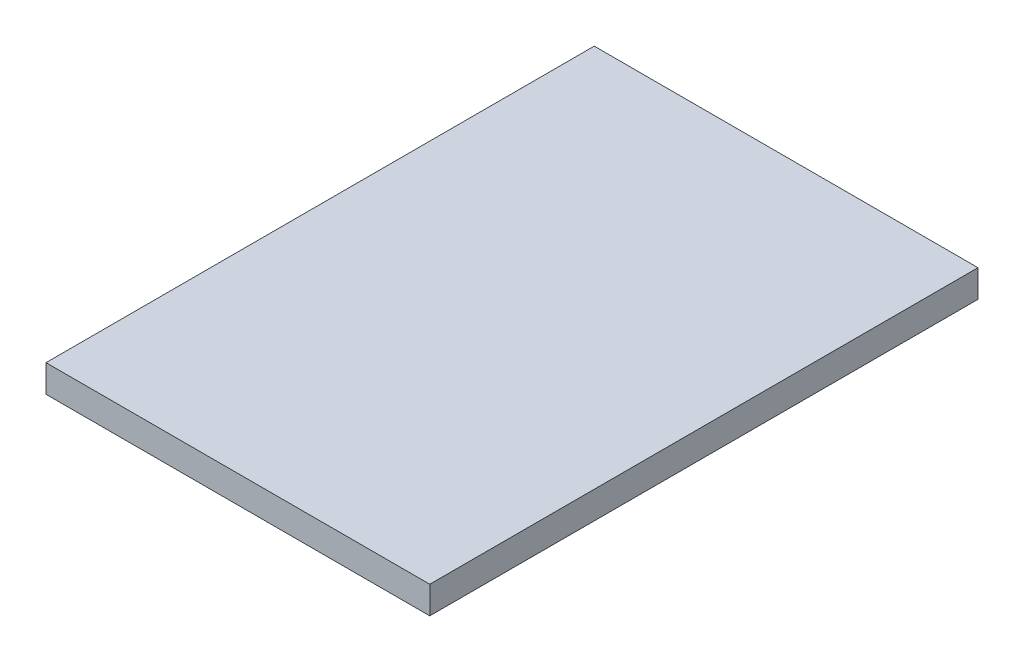
ISO-10303-21;
HEADER;
FILE_DESCRIPTION(('STEP AP214'),'2;1');
FILE_NAME('part.step','',(''),(''),'','','');
FILE_SCHEMA(('AUTOMOTIVE_DESIGN { 1 0 10303 214 1 1 1 1 }'));
ENDSEC;
DATA;
#1=APPLICATION_CONTEXT('core data for automotive mechanical design processes');
#2=APPLICATION_PROTOCOL_DEFINITION('international standard','automotive_design',2000,#1);
#3=PRODUCT_CONTEXT('',#1,'mechanical');
#4=PRODUCT('Part','Part','',(#3));
#5=PRODUCT_RELATED_PRODUCT_CATEGORY('part','',(#4));
#6=PRODUCT_DEFINITION_FORMATION('','',#4);
#7=PRODUCT_DEFINITION_CONTEXT('part definition',#1,'design');
#8=PRODUCT_DEFINITION('design','',#6,#7);
#9=PRODUCT_DEFINITION_SHAPE('','',#8);
#10=(LENGTH_UNIT() NAMED_UNIT(*) SI_UNIT(.MILLI.,.METRE.));
#11=(NAMED_UNIT(*) PLANE_ANGLE_UNIT() SI_UNIT($,.RADIAN.));
#12=(NAMED_UNIT(*) SI_UNIT($,.STERADIAN.) SOLID_ANGLE_UNIT());
#13=UNCERTAINTY_MEASURE_WITH_UNIT(LENGTH_MEASURE(1.E-05),#10,'distance_accuracy_value','');
#14=(GEOMETRIC_REPRESENTATION_CONTEXT(3) GLOBAL_UNCERTAINTY_ASSIGNED_CONTEXT((#13)) GLOBAL_UNIT_ASSIGNED_CONTEXT((#10,
#11,#12)) REPRESENTATION_CONTEXT('',''));
#15=CARTESIAN_POINT('',(0.,0.,0.));
#16=DIRECTION('',(0.,0.,1.));
#17=DIRECTION('',(1.,0.,0.));
#18=AXIS2_PLACEMENT_3D('',#15,#16,#17);
#19=CARTESIAN_POINT('',(-2352.90114334604,250.,3118.72909698997));
#20=DIRECTION('',(1.,0.,0.));
#21=DIRECTION('',(0.,0.,-1.));
#22=AXIS2_PLACEMENT_3D('',#19,#20,#21);
#23=PLANE('',#22);
#24=DIRECTION('',(0.,0.,1.));
#25=VECTOR('',#24,1.);
#26=CARTESIAN_POINT('',(-2352.90114334604,0.,3118.72909698997));
#27=LINE('',#26,#25);
#28=CARTESIAN_POINT('',(-2352.90114334604,0.,-1881.27090301003));
#29=VERTEX_POINT('',#28);
#30=CARTESIAN_POINT('',(-2352.90114334604,0.,3118.72909698997));
#31=VERTEX_POINT('',#30);
#32=EDGE_CURVE('E113',#29,#31,#27,.T.);
#33=ORIENTED_EDGE('',*,*,#32,.T.);
#34=DIRECTION('',(0.,-1.,0.));
#35=VECTOR('',#34,1.);
#36=CARTESIAN_POINT('',(-2352.90114334604,250.,3118.72909698997));
#37=LINE('',#36,#35);
#38=CARTESIAN_POINT('',(-2352.90114334604,250.,3118.72909698997));
#39=VERTEX_POINT('',#38);
#40=EDGE_CURVE('E11',#39,#31,#37,.T.);
#41=ORIENTED_EDGE('',*,*,#40,.F.);
#42=DIRECTION('',(0.,0.,1.));
#43=VECTOR('',#42,1.);
#44=CARTESIAN_POINT('',(-2352.90114334604,250.,3118.72909698997));
#45=LINE('',#44,#43);
#46=CARTESIAN_POINT('',(-2352.90114334604,250.,-1881.27090301003));
#47=VERTEX_POINT('',#46);
#48=EDGE_CURVE('E97',#47,#39,#45,.T.);
#49=ORIENTED_EDGE('',*,*,#48,.F.);
#50=DIRECTION('',(0.,-1.,0.));
#51=VECTOR('',#50,1.);
#52=CARTESIAN_POINT('',(-2352.90114334604,250.,-1881.27090301003));
#53=LINE('',#52,#51);
#54=EDGE_CURVE('E109',#47,#29,#53,.T.);
#55=ORIENTED_EDGE('',*,*,#54,.T.);
#56=EDGE_LOOP('',(#33,#41,#49,#55));
#57=FACE_BOUND('',#56,.T.);
#58=ADVANCED_FACE('F45',(#57),#23,.F.);
#59=CARTESIAN_POINT('',(-2352.90114334604,250.,3118.72909698997));
#60=DIRECTION('',(0.,0.,-1.));
#61=DIRECTION('',(-1.,0.,0.));
#62=AXIS2_PLACEMENT_3D('',#59,#60,#61);
#63=PLANE('',#62);
#64=DIRECTION('',(1.,0.,0.));
#65=VECTOR('',#64,1.);
#66=CARTESIAN_POINT('',(-2352.90114334604,0.,3118.72909698997));
#67=LINE('',#66,#65);
#68=CARTESIAN_POINT('',(1147.09885665396,0.,3118.72909698997));
#69=VERTEX_POINT('',#68);
#70=EDGE_CURVE('E102',#31,#69,#67,.T.);
#71=ORIENTED_EDGE('',*,*,#70,.T.);
#72=DIRECTION('',(0.,-1.,0.));
#73=VECTOR('',#72,1.);
#74=CARTESIAN_POINT('',(1147.09885665396,250.,3118.72909698997));
#75=LINE('',#74,#73);
#76=CARTESIAN_POINT('',(1147.09885665396,250.,3118.72909698997));
#77=VERTEX_POINT('',#76);
#78=EDGE_CURVE('E54',#77,#69,#75,.T.);
#79=ORIENTED_EDGE('',*,*,#78,.F.);
#80=DIRECTION('',(1.,0.,0.));
#81=VECTOR('',#80,1.);
#82=CARTESIAN_POINT('',(-2352.90114334604,250.,3118.72909698997));
#83=LINE('',#82,#81);
#84=EDGE_CURVE('E92',#39,#77,#83,.T.);
#85=ORIENTED_EDGE('',*,*,#84,.F.);
#86=ORIENTED_EDGE('',*,*,#40,.T.);
#87=EDGE_LOOP('',(#71,#79,#85,#86));
#88=FACE_BOUND('',#87,.T.);
#89=ADVANCED_FACE('F101',(#88),#63,.F.);
#90=CARTESIAN_POINT('',(1147.09885665396,250.,3118.72909698997));
#91=DIRECTION('',(-1.,0.,0.));
#92=DIRECTION('',(0.,0.,1.));
#93=AXIS2_PLACEMENT_3D('',#90,#91,#92);
#94=PLANE('',#93);
#95=DIRECTION('',(0.,0.,-1.));
#96=VECTOR('',#95,1.);
#97=CARTESIAN_POINT('',(1147.09885665396,0.,3118.72909698997));
#98=LINE('',#97,#96);
#99=CARTESIAN_POINT('',(1147.09885665396,0.,-1881.27090301003));
#100=VERTEX_POINT('',#99);
#101=EDGE_CURVE('E79',#69,#100,#98,.T.);
#102=ORIENTED_EDGE('',*,*,#101,.T.);
#103=DIRECTION('',(0.,-1.,0.));
#104=VECTOR('',#103,1.);
#105=CARTESIAN_POINT('',(1147.09885665396,250.,-1881.27090301003));
#106=LINE('',#105,#104);
#107=CARTESIAN_POINT('',(1147.09885665396,250.,-1881.27090301003));
#108=VERTEX_POINT('',#107);
#109=EDGE_CURVE('E104',#108,#100,#106,.T.);
#110=ORIENTED_EDGE('',*,*,#109,.F.);
#111=DIRECTION('',(0.,0.,-1.));
#112=VECTOR('',#111,1.);
#113=CARTESIAN_POINT('',(1147.09885665396,250.,3118.72909698997));
#114=LINE('',#113,#112);
#115=EDGE_CURVE('E95',#77,#108,#114,.T.);
#116=ORIENTED_EDGE('',*,*,#115,.F.);
#117=ORIENTED_EDGE('',*,*,#78,.T.);
#118=EDGE_LOOP('',(#102,#110,#116,#117));
#119=FACE_BOUND('',#118,.T.);
#120=ADVANCED_FACE('F105',(#119),#94,.F.);
#121=CARTESIAN_POINT('',(-2352.90114334604,250.,-1881.27090301003));
#122=DIRECTION('',(0.,0.,1.));
#123=DIRECTION('',(1.,0.,0.));
#124=AXIS2_PLACEMENT_3D('',#121,#122,#123);
#125=PLANE('',#124);
#126=DIRECTION('',(-1.,0.,0.));
#127=VECTOR('',#126,1.);
#128=CARTESIAN_POINT('',(-2352.90114334604,0.,-1881.27090301003));
#129=LINE('',#128,#127);
#130=EDGE_CURVE('E85',#100,#29,#129,.T.);
#131=ORIENTED_EDGE('',*,*,#130,.T.);
#132=ORIENTED_EDGE('',*,*,#54,.F.);
#133=DIRECTION('',(-1.,0.,0.));
#134=VECTOR('',#133,1.);
#135=CARTESIAN_POINT('',(-2352.90114334604,250.,-1881.27090301003));
#136=LINE('',#135,#134);
#137=EDGE_CURVE('E62',#108,#47,#136,.T.);
#138=ORIENTED_EDGE('',*,*,#137,.F.);
#139=ORIENTED_EDGE('',*,*,#109,.T.);
#140=EDGE_LOOP('',(#131,#132,#138,#139));
#141=FACE_BOUND('',#140,.T.);
#142=ADVANCED_FACE('F126',(#141),#125,.F.);
#143=CARTESIAN_POINT('',(0.,250.,0.));
#144=DIRECTION('',(0.,-1.,0.));
#145=DIRECTION('',(0.,0.,-1.));
#146=AXIS2_PLACEMENT_3D('',#143,#144,#145);
#147=PLANE('',#146);
#148=ORIENTED_EDGE('',*,*,#48,.T.);
#149=ORIENTED_EDGE('',*,*,#84,.T.);
#150=ORIENTED_EDGE('',*,*,#115,.T.);
#151=ORIENTED_EDGE('',*,*,#137,.T.);
#152=EDGE_LOOP('',(#148,#149,#150,#151));
#153=FACE_BOUND('',#152,.T.);
#154=ADVANCED_FACE('F93',(#153),#147,.F.);
#155=CARTESIAN_POINT('',(0.,0.,0.));
#156=DIRECTION('',(0.,-1.,0.));
#157=DIRECTION('',(0.,0.,-1.));
#158=AXIS2_PLACEMENT_3D('',#155,#156,#157);
#159=PLANE('',#158);
#160=ORIENTED_EDGE('',*,*,#32,.F.);
#161=ORIENTED_EDGE('',*,*,#130,.F.);
#162=ORIENTED_EDGE('',*,*,#101,.F.);
#163=ORIENTED_EDGE('',*,*,#70,.F.);
#164=EDGE_LOOP('',(#160,#161,#162,#163));
#165=FACE_BOUND('',#164,.T.);
#166=ADVANCED_FACE('F129',(#165),#159,.T.);
#167=CLOSED_SHELL('',(#58,#89,#120,#142,#154,#166));
#168=MANIFOLD_SOLID_BREP('B2',#167);
#169=ADVANCED_BREP_SHAPE_REPRESENTATION('',(#18,#168),#14);
#170=SHAPE_DEFINITION_REPRESENTATION(#9,#169);
ENDSEC;
END-ISO-10303-21;
